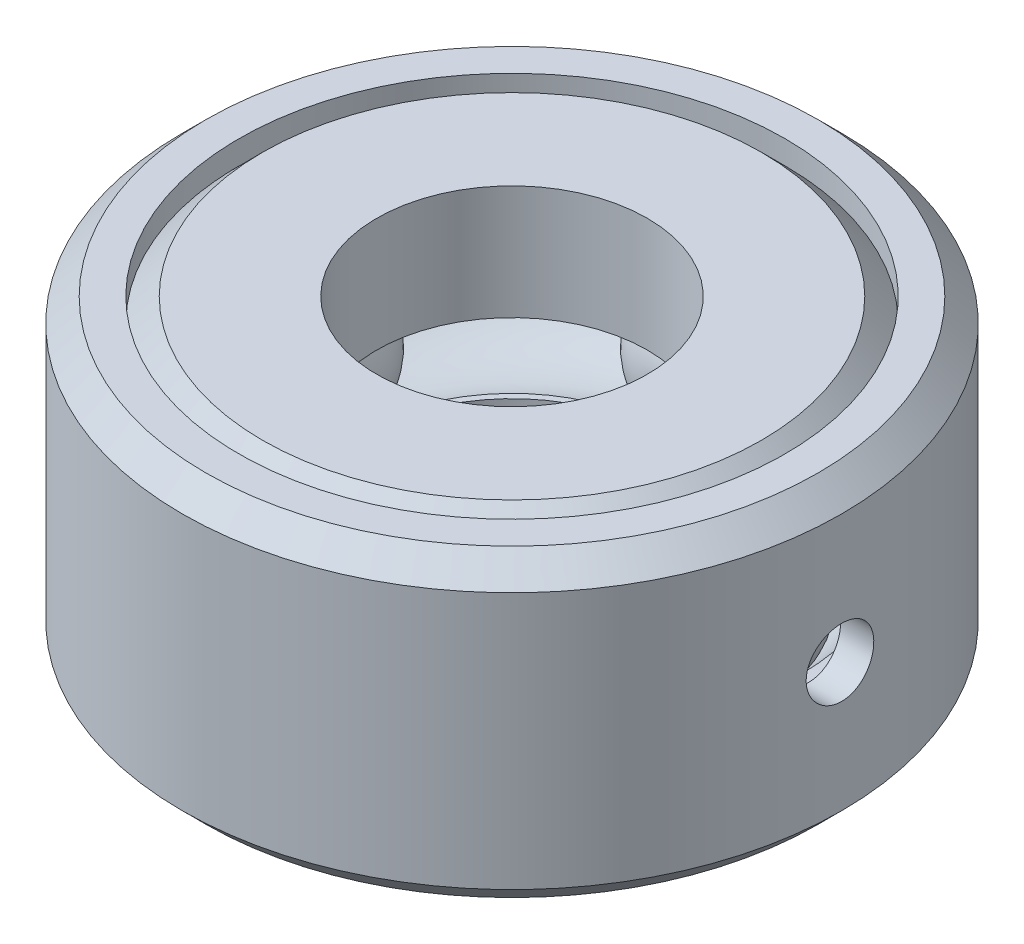
ISO-10303-21;
HEADER;
FILE_DESCRIPTION(('STEP AP214'),'2;1');
FILE_NAME('part.step','',(''),(''),'','','');
FILE_SCHEMA(('AUTOMOTIVE_DESIGN { 1 0 10303 214 1 1 1 1 }'));
ENDSEC;
DATA;
#1=APPLICATION_CONTEXT('core data for automotive mechanical design processes');
#2=APPLICATION_PROTOCOL_DEFINITION('international standard','automotive_design',2000,#1);
#3=PRODUCT_CONTEXT('',#1,'mechanical');
#4=PRODUCT('Part','Part','',(#3));
#5=PRODUCT_RELATED_PRODUCT_CATEGORY('part','',(#4));
#6=PRODUCT_DEFINITION_FORMATION('','',#4);
#7=PRODUCT_DEFINITION_CONTEXT('part definition',#1,'design');
#8=PRODUCT_DEFINITION('design','',#6,#7);
#9=PRODUCT_DEFINITION_SHAPE('','',#8);
#10=(LENGTH_UNIT() NAMED_UNIT(*) SI_UNIT(.MILLI.,.METRE.));
#11=(NAMED_UNIT(*) PLANE_ANGLE_UNIT() SI_UNIT($,.RADIAN.));
#12=(NAMED_UNIT(*) SI_UNIT($,.STERADIAN.) SOLID_ANGLE_UNIT());
#13=UNCERTAINTY_MEASURE_WITH_UNIT(LENGTH_MEASURE(1.E-05),#10,'distance_accuracy_value','');
#14=(GEOMETRIC_REPRESENTATION_CONTEXT(3) GLOBAL_UNCERTAINTY_ASSIGNED_CONTEXT((#13)) GLOBAL_UNIT_ASSIGNED_CONTEXT((#10,
#11,#12)) REPRESENTATION_CONTEXT('',''));
#15=CARTESIAN_POINT('',(0.,0.,0.));
#16=DIRECTION('',(0.,0.,1.));
#17=DIRECTION('',(1.,0.,0.));
#18=AXIS2_PLACEMENT_3D('',#15,#16,#17);
#19=CARTESIAN_POINT('',(0.,-7.14375,0.));
#20=DIRECTION('',(0.,-1.,0.));
#21=DIRECTION('',(0.,0.,-1.));
#22=AXIS2_PLACEMENT_3D('',#19,#20,#21);
#23=CYLINDRICAL_SURFACE('',#22,15.478125);
#24=CARTESIAN_POINT('',(0.,-6.03411069892396,0.));
#25=DIRECTION('',(0.,-1.,0.));
#26=DIRECTION('',(0.,0.,-1.));
#27=AXIS2_PLACEMENT_3D('',#24,#25,#26);
#28=CIRCLE('',#27,15.478125);
#29=CARTESIAN_POINT('',(0.,-6.03411069892396,-15.478125));
#30=VERTEX_POINT('',#29);
#31=EDGE_CURVE('E11',#30,#30,#28,.T.);
#32=ORIENTED_EDGE('',*,*,#31,.F.);
#33=EDGE_LOOP('',(#32));
#34=FACE_BOUND('',#33,.T.);
#35=CARTESIAN_POINT('',(0.,6.03411069892396,0.));
#36=DIRECTION('',(0.,-1.,0.));
#37=DIRECTION('',(0.,0.,-1.));
#38=AXIS2_PLACEMENT_3D('',#35,#36,#37);
#39=CIRCLE('',#38,15.478125);
#40=CARTESIAN_POINT('',(0.,6.03411069892396,-15.478125));
#41=VERTEX_POINT('',#40);
#42=EDGE_CURVE('E79',#41,#41,#39,.T.);
#43=ORIENTED_EDGE('',*,*,#42,.T.);
#44=EDGE_LOOP('',(#43));
#45=FACE_BOUND('',#44,.T.);
#46=CARTESIAN_POINT('',(15.478125,-1.5875,0.));
#47=CARTESIAN_POINT('',(15.4781239530843,-1.5874961555071,-0.0889199867715159));
#48=CARTESIAN_POINT('',(15.4773506103418,-1.58000388510939,-0.177898465576291));
#49=CARTESIAN_POINT('',(15.4743399585085,-1.55022933093622,-0.353387747904979));
#50=CARTESIAN_POINT('',(15.4721010443566,-1.52793083132391,-0.439895737274037));
#51=CARTESIAN_POINT('',(15.4664119360855,-1.46920052785929,-0.607877435908975));
#52=CARTESIAN_POINT('',(15.462962481438,-1.43277735079469,-0.689354182912763));
#53=CARTESIAN_POINT('',(15.455237810417,-1.34684856427046,-0.84502020815954));
#54=CARTESIAN_POINT('',(15.4509627561938,-1.29734552303323,-0.919210913093581));
#55=CARTESIAN_POINT('',(15.4420475774922,-1.1864617137409,-1.05849652138863));
#56=CARTESIAN_POINT('',(15.4374062752245,-1.12504161541223,-1.12356004190914));
#57=CARTESIAN_POINT('',(15.4282914204162,-0.992151140817035,-1.24247458019751));
#58=CARTESIAN_POINT('',(15.4238178757118,-0.920680295796511,-1.2963250747134));
#59=CARTESIAN_POINT('',(15.4155330561086,-0.769519935274034,-1.39139667738611));
#60=CARTESIAN_POINT('',(15.4117232839609,-0.689812405372675,-1.43258928549632));
#61=CARTESIAN_POINT('',(15.4052120633929,-0.524566090348588,-1.5009938255057));
#62=CARTESIAN_POINT('',(15.402510586252,-0.439027456400792,-1.52820611969704));
#63=CARTESIAN_POINT('',(15.3985325351609,-0.26486772713874,-1.56778429869553));
#64=CARTESIAN_POINT('',(15.3972509571595,-0.176258599272521,-1.58020233360475));
#65=CARTESIAN_POINT('',(15.3962422958536,0.00179471976225132,-1.59000071269503));
#66=CARTESIAN_POINT('',(15.3965151696989,0.0912388878441565,-1.58738147139493));
#67=CARTESIAN_POINT('',(15.3985800101881,0.268063444505963,-1.56722261574443));
#68=CARTESIAN_POINT('',(15.4003661746919,0.355450407183353,-1.54973998853043));
#69=CARTESIAN_POINT('',(15.4052472788507,0.526043310786195,-1.5004393218036));
#70=CARTESIAN_POINT('',(15.4083422370112,0.609249192575563,-1.46862107959508));
#71=CARTESIAN_POINT('',(15.4154988722847,0.769297767164598,-1.39148963649898));
#72=CARTESIAN_POINT('',(15.4195623542519,0.846128214540232,-1.34615120049619));
#73=CARTESIAN_POINT('',(15.4281966711317,0.991110969510635,-1.24328448718171));
#74=CARTESIAN_POINT('',(15.4327675216668,1.05926300974736,-1.18575583446807));
#75=CARTESIAN_POINT('',(15.4419274049905,1.18528547966697,-1.05982365549658));
#76=CARTESIAN_POINT('',(15.4465164237693,1.24310675027191,-0.991370922494405));
#77=CARTESIAN_POINT('',(15.4551755718366,1.34644516565287,-0.84570443652894));
#78=CARTESIAN_POINT('',(15.4592457004966,1.39196229552302,-0.768490672952238));
#79=CARTESIAN_POINT('',(15.4664099127705,1.46939857837733,-0.607459525806819));
#80=CARTESIAN_POINT('',(15.4695038134529,1.50131518320617,-0.523640908254246));
#81=CARTESIAN_POINT('',(15.4743651251431,1.55060811615165,-0.351795654195215));
#82=CARTESIAN_POINT('',(15.4761325778855,1.56798490174257,-0.263769150175914));
#83=CARTESIAN_POINT('',(15.4781364818146,1.5876424438966,-0.0864325302296536));
#84=CARTESIAN_POINT('',(15.4783798115395,1.58999102546963,0.00286999287364864));
#85=CARTESIAN_POINT('',(15.4773265087318,1.57970371130956,0.180597376539804));
#86=CARTESIAN_POINT('',(15.4760298981039,1.56706802871874,0.269022249568668));
#87=CARTESIAN_POINT('',(15.4720468054872,1.52722714299406,0.442288108951411));
#88=CARTESIAN_POINT('',(15.469363358584,1.50005375102779,0.527136485665286));
#89=CARTESIAN_POINT('',(15.4629075792383,1.43194152632021,0.691070678010777));
#90=CARTESIAN_POINT('',(15.459135221186,1.39100236982312,0.770156358056817));
#91=CARTESIAN_POINT('',(15.4509063099293,1.29635290304373,0.920626518399483));
#92=CARTESIAN_POINT('',(15.4464473924041,1.24259809439953,0.991982876728184));
#93=CARTESIAN_POINT('',(15.4373531377833,1.12390694912989,1.12468405006275));
#94=CARTESIAN_POINT('',(15.4327177960279,1.05897031700876,1.18602860040878));
#95=CARTESIAN_POINT('',(15.4237723800889,0.919462629348938,1.29720078644868));
#96=CARTESIAN_POINT('',(15.419463606017,0.844855972693171,1.34698386643892));
#97=CARTESIAN_POINT('',(15.4116790995339,0.688301376942994,1.43331351716352));
#98=CARTESIAN_POINT('',(15.4082033552216,0.606353542750534,1.46986027700101));
#99=CARTESIAN_POINT('',(15.4024866250567,0.437594753960745,1.52860549432891));
#100=CARTESIAN_POINT('',(15.4002433700341,0.350793062915152,1.55083033343994));
#101=CARTESIAN_POINT('',(15.3972386054293,0.17466573817968,1.5803863707159));
#102=CARTESIAN_POINT('',(15.3964770509417,0.0853401810629074,1.58771802024346));
#103=CARTESIAN_POINT('',(15.3965228904662,-0.0928563652618088,1.58727310979684));
#104=CARTESIAN_POINT('',(15.3973230161166,-0.181727539361156,1.57956654064211));
#105=CARTESIAN_POINT('',(15.4003865517389,-0.356905500105158,1.54941084003613));
#106=CARTESIAN_POINT('',(15.4026499632413,-0.443212284067464,1.52696169316475));
#107=CARTESIAN_POINT('',(15.408383002742,-0.610810185582333,1.46797764404171));
#108=CARTESIAN_POINT('',(15.411852444112,-0.692102076878648,1.43144492107069));
#109=CARTESIAN_POINT('',(15.4196069947713,-0.847411501088066,1.34533791942205));
#110=CARTESIAN_POINT('',(15.4238921008788,-0.921429062375461,1.29576369161698));
#111=CARTESIAN_POINT('',(15.4328190525166,-1.06044740123926,1.18471828622745));
#112=CARTESIAN_POINT('',(15.4374624065755,-1.12540640933313,1.12319493694925));
#113=CARTESIAN_POINT('',(15.446568922496,-1.2441087471732,0.990101758505084));
#114=CARTESIAN_POINT('',(15.451032040999,-1.29784939097626,0.918529530243505));
#115=CARTESIAN_POINT('',(15.4592875146933,-1.39270185843258,0.767162922441059));
#116=CARTESIAN_POINT('',(15.4630780730155,-1.43378006141091,0.687347392336483));
#117=CARTESIAN_POINT('',(15.469541966481,-1.5018959100463,0.521962997897064));
#118=CARTESIAN_POINT('',(15.4722165564352,-1.52894933371441,0.436400721701389));
#119=CARTESIAN_POINT('',(15.4754776245012,-1.5615266358443,0.291964794145523));
#120=CARTESIAN_POINT('',(15.4764657419542,-1.57125327644695,0.234013386463272));
#121=CARTESIAN_POINT('',(15.4777897738538,-1.58424121337437,0.117383148391143));
#122=CARTESIAN_POINT('',(15.478125691166,-1.58750253810594,0.0587043211984845));
#123=CARTESIAN_POINT('',(15.478125,-1.5875,0.));
#124=B_SPLINE_CURVE_WITH_KNOTS('',3,(#46,#47,#48,#49,#50,#51,#52,#53,#54,#55,#56,#57,#58,#59,
#60,#61,#62,#63,#64,#65,#66,#67,#68,#69,#70,#71,#72,#73,#74,#75,#76,#77,#78,#79,#80,#81,#82,#83,
#84,#85,#86,#87,#88,#89,#90,#91,#92,#93,#94,#95,#96,#97,#98,#99,#100,#101,#102,#103,#104,#105,
#106,#107,#108,#109,#110,#111,#112,#113,#114,#115,#116,#117,#118,#119,#120,#121,#122,#123),
.UNSPECIFIED.,.T.,.F.,(4,2,2,2,2,2,2,2,2,2,2,2,2,2,2,2,2,2,2,2,2,2,2,2,2,2,2,2,2,2,2,2,2,2,2,2,
2,2,4),(0.,0.266545588486843,0.533383581244815,0.800058856063831,1.06668180823524,
1.33420015120846,1.60173097503641,1.86985982115217,2.13798171850566,2.40515565682361,
2.67232223023698,2.93846906618705,3.20461966538747,3.47127017106803,3.73792888953679,
4.00582454087067,4.27372051674593,4.54166666279757,4.80960437799654,5.07633198371415,
5.34305579543503,5.60919833959687,5.87534714357915,6.14243388200146,6.40952767965692,
6.6776343298453,6.94573714952755,7.21334468932496,7.48094411871455,7.7473010580765,
8.01365827603753,8.27997429464149,8.54628927441051,8.81379428375181,9.08136326687967,
9.34963668504165,9.61760763447262,9.79357984453894,9.9695512814306),.UNSPECIFIED.);
#125=CARTESIAN_POINT('',(15.478125,-1.5875,0.));
#126=VERTEX_POINT('',#125);
#127=EDGE_CURVE('E82',#126,#126,#124,.T.);
#128=ORIENTED_EDGE('',*,*,#127,.F.);
#129=EDGE_LOOP('',(#128));
#130=FACE_BOUND('',#129,.T.);
#131=ADVANCED_FACE('F39',(#34,#45,#130),#23,.T.);
#132=CARTESIAN_POINT('',(0.,-7.14375,0.));
#133=DIRECTION('',(0.,-1.,0.));
#134=DIRECTION('',(0.,0.,-1.));
#135=AXIS2_PLACEMENT_3D('',#132,#133,#134);
#136=CYLINDRICAL_SURFACE('',#135,13.9303125);
#137=CARTESIAN_POINT('',(0.,4.92447139784791,0.));
#138=DIRECTION('',(0.,-1.,0.));
#139=DIRECTION('',(0.,0.,-1.));
#140=AXIS2_PLACEMENT_3D('',#137,#138,#139);
#141=CIRCLE('',#140,13.9303125);
#142=CARTESIAN_POINT('',(0.,4.92447139784791,-13.9303125));
#143=VERTEX_POINT('',#142);
#144=EDGE_CURVE('E67',#143,#143,#141,.T.);
#145=ORIENTED_EDGE('',*,*,#144,.F.);
#146=EDGE_LOOP('',(#145));
#147=FACE_BOUND('',#146,.T.);
#148=CARTESIAN_POINT('',(0.,-4.92447139784791,0.));
#149=DIRECTION('',(0.,-1.,0.));
#150=DIRECTION('',(0.,0.,-1.));
#151=AXIS2_PLACEMENT_3D('',#148,#149,#150);
#152=CIRCLE('',#151,13.9303125);
#153=CARTESIAN_POINT('',(0.,-4.92447139784791,-13.9303125));
#154=VERTEX_POINT('',#153);
#155=EDGE_CURVE('E64',#154,#154,#152,.T.);
#156=ORIENTED_EDGE('',*,*,#155,.T.);
#157=EDGE_LOOP('',(#156));
#158=FACE_BOUND('',#157,.T.);
#159=CARTESIAN_POINT('',(13.8395610514805,0.,1.5875));
#160=CARTESIAN_POINT('',(13.8395622268779,0.0888593892608518,1.58749618686039));
#161=CARTESIAN_POINT('',(13.8404260906163,0.177775826264972,1.58001406805566));
#162=CARTESIAN_POINT('',(13.8437872892556,0.353138516025982,1.55028224181444));
#163=CARTESIAN_POINT('',(13.8462863747378,0.439582017760158,1.52801670766478));
#164=CARTESIAN_POINT('',(13.8526313550373,0.607434224038868,1.46937916148668));
#165=CARTESIAN_POINT('',(13.8564763813982,0.688846135413641,1.43301624404547));
#166=CARTESIAN_POINT('',(13.8650789500554,0.84439539793967,1.34723471586057));
#167=CARTESIAN_POINT('',(13.8698363245155,0.91853408329253,1.29781850577921));
#168=CARTESIAN_POINT('',(13.8797524740017,1.05779540609215,1.18708529161634));
#169=CARTESIAN_POINT('',(13.8849128401947,1.12287915604463,1.12571951886663));
#170=CARTESIAN_POINT('',(13.8950391644464,1.24184767471582,0.992933830768743));
#171=CARTESIAN_POINT('',(13.9000051131945,1.29573190762141,0.921513434656114));
#172=CARTESIAN_POINT('',(13.90919913437,1.39090922105532,0.770403969485906));
#173=CARTESIAN_POINT('',(13.9134251495219,1.43216742739877,0.690692798868989));
#174=CARTESIAN_POINT('',(13.9206457288841,1.50069828235261,0.525417281922924));
#175=CARTESIAN_POINT('',(13.9236403314239,1.52797136627637,0.439853117873241));
#176=CARTESIAN_POINT('',(13.9280494831672,1.56764248433091,0.265696342084031));
#177=CARTESIAN_POINT('',(13.9294708660438,1.5801048699854,0.177118564722521));
#178=CARTESIAN_POINT('',(13.9305967220498,1.59000011603427,-0.000881855590568196));
#179=CARTESIAN_POINT('',(13.9303012519454,1.58743347334874,-0.0903044705108183));
#180=CARTESIAN_POINT('',(13.9280322516452,1.56739540203593,-0.267018819162722));
#181=CARTESIAN_POINT('',(13.9260665127516,1.54999317570139,-0.35431851397619));
#182=CARTESIAN_POINT('',(13.9206866856252,1.50088592704909,-0.524750141143267));
#183=CARTESIAN_POINT('',(13.9172725738617,1.46918067235978,-0.607882005760596));
#184=CARTESIAN_POINT('',(13.9093662869913,1.39229270291149,-0.767834230875383));
#185=CARTESIAN_POINT('',(13.9048716955688,1.34707972453035,-0.844639919569219));
#186=CARTESIAN_POINT('',(13.8953080012828,1.24448173196703,-0.989599491534462));
#187=CARTESIAN_POINT('',(13.8902388765176,1.18709625368426,-1.05775304476769));
#188=CARTESIAN_POINT('',(13.8800601536455,1.0613938737598,-1.18387970774223));
#189=CARTESIAN_POINT('',(13.874950489227,0.993016712047259,-1.24179277140944));
#190=CARTESIAN_POINT('',(13.8652951472049,0.847479843761716,-1.34532868458285));
#191=CARTESIAN_POINT('',(13.8607494708746,0.770320117358782,-1.39095150633844));
#192=CARTESIAN_POINT('',(13.8527366518241,0.609358351650445,-1.46861355196661));
#193=CARTESIAN_POINT('',(13.8492698500637,0.525554222973512,-1.50064848277772));
#194=CARTESIAN_POINT('',(13.8438141683692,0.353707995131995,-1.55017484083026));
#195=CARTESIAN_POINT('',(13.8418252295802,0.265666064883854,-1.56766684723767));
#196=CARTESIAN_POINT('',(13.8395609938691,0.0883722492987613,-1.58753237334695));
#197=CARTESIAN_POINT('',(13.8392761454651,-0.000870076614533223,-1.58999016207764));
#198=CARTESIAN_POINT('',(13.8404271102251,-0.178495239834938,-1.57993934553969));
#199=CARTESIAN_POINT('',(13.8418628930382,-0.266878092274927,-1.56743100426468));
#200=CARTESIAN_POINT('',(13.8462846429256,-0.440026152264252,-1.52787373789018));
#201=CARTESIAN_POINT('',(13.8492663069672,-0.524800698533142,-1.50086516748244));
#202=CARTESIAN_POINT('',(13.8564403772041,-0.688616982680918,-1.43311549553363));
#203=CARTESIAN_POINT('',(13.8606328190721,-0.767658551565339,-1.39237398937821));
#204=CARTESIAN_POINT('',(13.8697790635717,-0.918147775991338,-1.29810592664415));
#205=CARTESIAN_POINT('',(13.8747361390073,-0.989560442500136,-1.24452383629236));
#206=CARTESIAN_POINT('',(13.884842644483,-1.12240874324144,-1.12617461743575));
#207=CARTESIAN_POINT('',(13.8899920807187,-1.18384405578094,-1.06140712842665));
#208=CARTESIAN_POINT('',(13.8999322097151,-1.29528720923773,-0.92215868641165));
#209=CARTESIAN_POINT('',(13.904721098536,-1.34523986322066,-0.847633419301476));
#210=CARTESIAN_POINT('',(13.9133739289703,-1.43191885853933,-0.691201995603963));
#211=CARTESIAN_POINT('',(13.9172378864838,-1.46864542724483,-0.609295965929653));
#212=CARTESIAN_POINT('',(13.9235974255924,-1.52773746916376,-0.440615735535861));
#213=CARTESIAN_POINT('',(13.9260961082448,-1.55013550785467,-0.353853064864225));
#214=CARTESIAN_POINT('',(13.9294563743146,-1.58004079985156,-0.177768306718376));
#215=CARTESIAN_POINT('',(13.9303180184842,-1.58754860575063,-0.0884463143482384));
#216=CARTESIAN_POINT('',(13.9303069585414,-1.58745119367456,0.0896812305051286));
#217=CARTESIAN_POINT('',(13.9294440504273,-1.57993133755413,0.178486842490444));
#218=CARTESIAN_POINT('',(13.9261002341824,-1.55017201551395,0.353563906135039));
#219=CARTESIAN_POINT('',(13.9236193259457,-1.52793254863047,0.439835357628403));
#220=CARTESIAN_POINT('',(13.9173172039266,-1.46939066926815,0.607388843620715));
#221=CARTESIAN_POINT('',(13.9134963102309,-1.43309161503373,0.688672064231455));
#222=CARTESIAN_POINT('',(13.9049386279004,-1.34746984137599,0.844006306181949));
#223=CARTESIAN_POINT('',(13.9002018359067,-1.29814707419097,0.918057300997692));
#224=CARTESIAN_POINT('',(13.8903098421313,-1.18755985438036,1.0572619898554));
#225=CARTESIAN_POINT('',(13.8851525012924,-1.12623180266259,1.12236500949701));
#226=CARTESIAN_POINT('',(13.8750183152747,-0.993504824591994,1.24139082202088));
#227=CARTESIAN_POINT('',(13.8700415133789,-0.922103503031296,1.29531094829667));
#228=CARTESIAN_POINT('',(13.8608147520585,-0.770996863921944,1.39058485171154));
#229=CARTESIAN_POINT('',(13.8565671920285,-0.691265471754633,1.43189748089494));
#230=CARTESIAN_POINT('',(13.8493081085589,-0.525996114271928,1.50049049818658));
#231=CARTESIAN_POINT('',(13.8462952181066,-0.440464693687051,1.52778641397053));
#232=CARTESIAN_POINT('',(13.8425914832913,-0.295392044212082,1.56090814094677));
#233=CARTESIAN_POINT('',(13.841460595838,-0.236772032538757,1.57086608555125));
#234=CARTESIAN_POINT('',(13.8399449892649,-0.11877650857569,1.58416327008271));
#235=CARTESIAN_POINT('',(13.8395602657472,-0.0594010007408405,1.58750254901942));
#236=CARTESIAN_POINT('',(13.8395610514805,0.,1.5875));
#237=B_SPLINE_CURVE_WITH_KNOTS('',3,(#159,#160,#161,#162,#163,#164,#165,#166,#167,#168,#169,
#170,#171,#172,#173,#174,#175,#176,#177,#178,#179,#180,#181,#182,#183,#184,#185,#186,#187,#188,
#189,#190,#191,#192,#193,#194,#195,#196,#197,#198,#199,#200,#201,#202,#203,#204,#205,#206,#207,
#208,#209,#210,#211,#212,#213,#214,#215,#216,#217,#218,#219,#220,#221,#222,#223,#224,#225,#226,
#227,#228,#229,#230,#231,#232,#233,#234,#235,#236),.UNSPECIFIED.,.T.,.F.,(4,2,2,2,2,2,2,2,2,2,2,
2,2,2,2,2,2,2,2,2,2,2,2,2,2,2,2,2,2,2,2,2,2,2,2,2,2,2,4),(0.,0.266361204744225,
0.533008029168913,0.799483118303192,1.06590923344574,1.33344638377016,1.60099633080124,
1.86927873945182,2.13755279679806,2.40465690878378,2.67175218928356,2.93760834758058,
3.20346882521712,3.46992947960698,3.73640029516238,4.00438520879524,4.2723707275165,
4.54044085266319,4.80850030151589,5.07505585012082,5.34160669691359,5.60741953904702,
5.87324021352567,6.14023196017685,6.40723231355206,6.67549025317784,6.94374358095857,
7.21138504358317,7.4790165735498,7.74513219321393,8.01124783030121,8.27729994270854,
8.54335303081885,8.81085568636922,9.07842205586397,9.3468525840287,9.61498510059609,
9.79304411615695,9.97110208225321),.UNSPECIFIED.);
#238=CARTESIAN_POINT('',(13.8395610514805,0.,1.5875));
#239=VERTEX_POINT('',#238);
#240=EDGE_CURVE('E43',#239,#239,#237,.T.);
#241=ORIENTED_EDGE('',*,*,#240,.F.);
#242=EDGE_LOOP('',(#241));
#243=FACE_BOUND('',#242,.T.);
#244=ADVANCED_FACE('F109',(#147,#158,#243),#136,.F.);
#245=CARTESIAN_POINT('',(0.,-6.03411069892396,0.));
#246=DIRECTION('',(0.,1.,0.));
#247=DIRECTION('',(0.,0.,1.));
#248=AXIS2_PLACEMENT_3D('',#245,#246,#247);
#249=CONICAL_SURFACE('',#248,15.478125,0.785398163397455);
#250=CARTESIAN_POINT('',(0.,-7.14375,0.));
#251=DIRECTION('',(0.,-1.,0.));
#252=DIRECTION('',(0.,0.,-1.));
#253=AXIS2_PLACEMENT_3D('',#250,#251,#252);
#254=CIRCLE('',#253,14.3684856989239);
#255=CARTESIAN_POINT('',(0.,-7.14375,-14.3684856989239));
#256=VERTEX_POINT('',#255);
#257=EDGE_CURVE('E52',#256,#256,#254,.T.);
#258=ORIENTED_EDGE('',*,*,#257,.F.);
#259=EDGE_LOOP('',(#258));
#260=FACE_BOUND('',#259,.T.);
#261=ORIENTED_EDGE('',*,*,#31,.T.);
#262=EDGE_LOOP('',(#261));
#263=FACE_BOUND('',#262,.T.);
#264=ADVANCED_FACE('F113',(#260,#263),#249,.T.);
#265=CARTESIAN_POINT('',(0.,-7.14375,14.3684856989239));
#266=DIRECTION('',(0.,1.,0.));
#267=DIRECTION('',(0.,0.,1.));
#268=AXIS2_PLACEMENT_3D('',#265,#266,#267);
#269=PLANE('',#268);
#270=CARTESIAN_POINT('',(0.,-7.14375,0.));
#271=DIRECTION('',(0.,-1.,0.));
#272=DIRECTION('',(0.,0.,-1.));
#273=AXIS2_PLACEMENT_3D('',#270,#271,#272);
#274=CIRCLE('',#273,12.820673198924);
#275=CARTESIAN_POINT('',(0.,-7.14375,-12.820673198924));
#276=VERTEX_POINT('',#275);
#277=EDGE_CURVE('E56',#276,#276,#274,.T.);
#278=ORIENTED_EDGE('',*,*,#277,.F.);
#279=EDGE_LOOP('',(#278));
#280=FACE_BOUND('',#279,.T.);
#281=ORIENTED_EDGE('',*,*,#257,.T.);
#282=EDGE_LOOP('',(#281));
#283=FACE_BOUND('',#282,.T.);
#284=ADVANCED_FACE('F121',(#280,#283),#269,.F.);
#285=CARTESIAN_POINT('',(0.,-7.14375,0.));
#286=DIRECTION('',(0.,-1.,0.));
#287=DIRECTION('',(0.,0.,-1.));
#288=AXIS2_PLACEMENT_3D('',#285,#286,#287);
#289=CYLINDRICAL_SURFACE('',#288,12.820673198924);
#290=CARTESIAN_POINT('',(0.,-6.03411069892395,0.));
#291=DIRECTION('',(0.,-1.,0.));
#292=DIRECTION('',(0.,0.,-1.));
#293=AXIS2_PLACEMENT_3D('',#290,#291,#292);
#294=CIRCLE('',#293,12.820673198924);
#295=CARTESIAN_POINT('',(0.,-6.03411069892395,-12.820673198924));
#296=VERTEX_POINT('',#295);
#297=EDGE_CURVE('E61',#296,#296,#294,.T.);
#298=ORIENTED_EDGE('',*,*,#297,.F.);
#299=EDGE_LOOP('',(#298));
#300=FACE_BOUND('',#299,.T.);
#301=ORIENTED_EDGE('',*,*,#277,.T.);
#302=EDGE_LOOP('',(#301));
#303=FACE_BOUND('',#302,.T.);
#304=ADVANCED_FACE('F117',(#300,#303),#289,.F.);
#305=CARTESIAN_POINT('',(0.,-6.03411069892395,0.));
#306=DIRECTION('',(0.,1.,0.));
#307=DIRECTION('',(0.,0.,1.));
#308=AXIS2_PLACEMENT_3D('',#305,#306,#307);
#309=CONICAL_SURFACE('',#308,12.820673198924,0.785398163397453);
#310=ORIENTED_EDGE('',*,*,#155,.F.);
#311=EDGE_LOOP('',(#310));
#312=FACE_BOUND('',#311,.T.);
#313=ORIENTED_EDGE('',*,*,#297,.T.);
#314=EDGE_LOOP('',(#313));
#315=FACE_BOUND('',#314,.T.);
#316=ADVANCED_FACE('F107',(#312,#315),#309,.F.);
#317=CARTESIAN_POINT('',(0.,4.92447139784791,0.));
#318=DIRECTION('',(0.,-1.,0.));
#319=DIRECTION('',(0.,0.,-1.));
#320=AXIS2_PLACEMENT_3D('',#317,#318,#319);
#321=CONICAL_SURFACE('',#320,13.9303125,0.785398163397444);
#322=CARTESIAN_POINT('',(0.,6.03411069892396,0.));
#323=DIRECTION('',(0.,-1.,0.));
#324=DIRECTION('',(0.,0.,-1.));
#325=AXIS2_PLACEMENT_3D('',#322,#323,#324);
#326=CIRCLE('',#325,12.820673198924);
#327=CARTESIAN_POINT('',(0.,6.03411069892396,-12.820673198924));
#328=VERTEX_POINT('',#327);
#329=EDGE_CURVE('E70',#328,#328,#326,.T.);
#330=ORIENTED_EDGE('',*,*,#329,.F.);
#331=EDGE_LOOP('',(#330));
#332=FACE_BOUND('',#331,.T.);
#333=ORIENTED_EDGE('',*,*,#144,.T.);
#334=EDGE_LOOP('',(#333));
#335=FACE_BOUND('',#334,.T.);
#336=ADVANCED_FACE('F104',(#332,#335),#321,.F.);
#337=CARTESIAN_POINT('',(0.,-7.14375,0.));
#338=DIRECTION('',(0.,-1.,0.));
#339=DIRECTION('',(0.,0.,-1.));
#340=AXIS2_PLACEMENT_3D('',#337,#338,#339);
#341=CYLINDRICAL_SURFACE('',#340,12.820673198924);
#342=CARTESIAN_POINT('',(0.,7.14375,0.));
#343=DIRECTION('',(0.,-1.,0.));
#344=DIRECTION('',(0.,0.,-1.));
#345=AXIS2_PLACEMENT_3D('',#342,#343,#344);
#346=CIRCLE('',#345,12.820673198924);
#347=CARTESIAN_POINT('',(0.,7.14375,-12.820673198924));
#348=VERTEX_POINT('',#347);
#349=EDGE_CURVE('E73',#348,#348,#346,.T.);
#350=ORIENTED_EDGE('',*,*,#349,.F.);
#351=EDGE_LOOP('',(#350));
#352=FACE_BOUND('',#351,.T.);
#353=ORIENTED_EDGE('',*,*,#329,.T.);
#354=EDGE_LOOP('',(#353));
#355=FACE_BOUND('',#354,.T.);
#356=ADVANCED_FACE('F100',(#352,#355),#341,.F.);
#357=CARTESIAN_POINT('',(0.,7.14375,12.820673198924));
#358=DIRECTION('',(0.,-1.,0.));
#359=DIRECTION('',(0.,0.,-1.));
#360=AXIS2_PLACEMENT_3D('',#357,#358,#359);
#361=PLANE('',#360);
#362=CARTESIAN_POINT('',(0.,7.14375,0.));
#363=DIRECTION('',(0.,-1.,0.));
#364=DIRECTION('',(0.,0.,-1.));
#365=AXIS2_PLACEMENT_3D('',#362,#363,#364);
#366=CIRCLE('',#365,14.368485698924);
#367=CARTESIAN_POINT('',(0.,7.14375,-14.368485698924));
#368=VERTEX_POINT('',#367);
#369=EDGE_CURVE('E76',#368,#368,#366,.T.);
#370=ORIENTED_EDGE('',*,*,#369,.F.);
#371=EDGE_LOOP('',(#370));
#372=FACE_BOUND('',#371,.T.);
#373=ORIENTED_EDGE('',*,*,#349,.T.);
#374=EDGE_LOOP('',(#373));
#375=FACE_BOUND('',#374,.T.);
#376=ADVANCED_FACE('F96',(#372,#375),#361,.F.);
#377=CARTESIAN_POINT('',(0.,7.14375,0.));
#378=DIRECTION('',(0.,-1.,0.));
#379=DIRECTION('',(0.,0.,-1.));
#380=AXIS2_PLACEMENT_3D('',#377,#378,#379);
#381=CONICAL_SURFACE('',#380,14.368485698924,0.785398163397445);
#382=ORIENTED_EDGE('',*,*,#42,.F.);
#383=EDGE_LOOP('',(#382));
#384=FACE_BOUND('',#383,.T.);
#385=ORIENTED_EDGE('',*,*,#369,.T.);
#386=EDGE_LOOP('',(#385));
#387=FACE_BOUND('',#386,.T.);
#388=ADVANCED_FACE('F91',(#384,#387),#381,.T.);
#389=CARTESIAN_POINT('',(15.478125,0.,0.));
#390=DIRECTION('',(-1.,0.,0.));
#391=DIRECTION('',(0.,0.,1.));
#392=AXIS2_PLACEMENT_3D('',#389,#390,#391);
#393=CYLINDRICAL_SURFACE('',#392,1.5875);
#394=ORIENTED_EDGE('',*,*,#240,.T.);
#395=EDGE_LOOP('',(#394));
#396=FACE_BOUND('',#395,.T.);
#397=ORIENTED_EDGE('',*,*,#127,.T.);
#398=EDGE_LOOP('',(#397));
#399=FACE_BOUND('',#398,.T.);
#400=ADVANCED_FACE('F87',(#396,#399),#393,.F.);
#401=CLOSED_SHELL('',(#131,#244,#264,#284,#304,#316,#336,#356,#376,#388,#400));
#402=MANIFOLD_SOLID_BREP('B2',#401);
#403=CARTESIAN_POINT('',(-10.14015625,0.,1.06212498959486E-13));
#404=DIRECTION('',(0.,1.,0.));
#405=DIRECTION('',(1.,0.,0.));
#406=AXIS2_PLACEMENT_3D('',#403,#404,#405);
#407=SPHERICAL_SURFACE('',#406,3.571875);
#408=CARTESIAN_POINT('',(-10.14015625,3.571875,1.06212498959486E-13));
#409=VERTEX_POINT('',#408);
#410=VERTEX_LOOP('',#409);
#411=FACE_BOUND('',#410,.T.);
#412=ADVANCED_FACE('F227',(#411),#407,.T.);
#413=CLOSED_SHELL('',(#412));
#414=MANIFOLD_SOLID_BREP('B6',#413);
#415=CARTESIAN_POINT('',(0.,0.,-10.14015625));
#416=DIRECTION('',(0.,1.,0.));
#417=DIRECTION('',(0.,0.,1.));
#418=AXIS2_PLACEMENT_3D('',#415,#416,#417);
#419=SPHERICAL_SURFACE('',#418,3.571875);
#420=CARTESIAN_POINT('',(0.,3.571875,-10.14015625));
#421=VERTEX_POINT('',#420);
#422=VERTEX_LOOP('',#421);
#423=FACE_BOUND('',#422,.T.);
#424=ADVANCED_FACE('F258',(#423),#419,.T.);
#425=CLOSED_SHELL('',(#424));
#426=MANIFOLD_SOLID_BREP('B35',#425);
#427=CARTESIAN_POINT('',(10.14015625,0.,0.));
#428=DIRECTION('',(0.,1.,0.));
#429=DIRECTION('',(-1.,0.,0.));
#430=AXIS2_PLACEMENT_3D('',#427,#428,#429);
#431=SPHERICAL_SURFACE('',#430,3.571875);
#432=CARTESIAN_POINT('',(10.14015625,3.571875,0.));
#433=VERTEX_POINT('',#432);
#434=VERTEX_LOOP('',#433);
#435=FACE_BOUND('',#434,.T.);
#436=ADVANCED_FACE('F289',(#435),#431,.T.);
#437=CLOSED_SHELL('',(#436));
#438=MANIFOLD_SOLID_BREP('B223',#437);
#439=CARTESIAN_POINT('',(0.,0.,10.14015625));
#440=DIRECTION('',(0.,1.,0.));
#441=DIRECTION('',(0.,0.,-1.));
#442=AXIS2_PLACEMENT_3D('',#439,#440,#441);
#443=SPHERICAL_SURFACE('',#442,3.571875);
#444=CARTESIAN_POINT('',(0.,3.571875,10.14015625));
#445=VERTEX_POINT('',#444);
#446=VERTEX_LOOP('',#445);
#447=FACE_BOUND('',#446,.T.);
#448=ADVANCED_FACE('F322',(#447),#443,.T.);
#449=CLOSED_SHELL('',(#448));
#450=MANIFOLD_SOLID_BREP('B254',#449);
#451=CARTESIAN_POINT('',(0.,-7.14375,11.7110338978479));
#452=DIRECTION('',(0.,1.,0.));
#453=DIRECTION('',(0.,0.,1.));
#454=AXIS2_PLACEMENT_3D('',#451,#452,#453);
#455=PLANE('',#454);
#456=CARTESIAN_POINT('',(0.,-7.14375,0.));
#457=DIRECTION('',(0.,-1.,0.));
#458=DIRECTION('',(0.,0.,-1.));
#459=AXIS2_PLACEMENT_3D('',#456,#457,#458);
#460=CIRCLE('',#459,6.7437);
#461=CARTESIAN_POINT('',(0.,-7.14375,-6.7437));
#462=VERTEX_POINT('',#461);
#463=EDGE_CURVE('E366',#462,#462,#460,.T.);
#464=ORIENTED_EDGE('',*,*,#463,.F.);
#465=EDGE_LOOP('',(#464));
#466=FACE_BOUND('',#465,.T.);
#467=CARTESIAN_POINT('',(0.,-7.14375,0.));
#468=DIRECTION('',(0.,-1.,0.));
#469=DIRECTION('',(0.,0.,-1.));
#470=AXIS2_PLACEMENT_3D('',#467,#468,#469);
#471=CIRCLE('',#470,11.7110338978479);
#472=CARTESIAN_POINT('',(0.,-7.14375,-11.7110338978479));
#473=VERTEX_POINT('',#472);
#474=EDGE_CURVE('E321',#473,#473,#471,.T.);
#475=ORIENTED_EDGE('',*,*,#474,.T.);
#476=EDGE_LOOP('',(#475));
#477=FACE_BOUND('',#476,.T.);
#478=ADVANCED_FACE('F341',(#466,#477),#455,.F.);
#479=CARTESIAN_POINT('',(0.,-4.92447139784791,0.));
#480=DIRECTION('',(0.,1.,0.));
#481=DIRECTION('',(0.,0.,1.));
#482=AXIS2_PLACEMENT_3D('',#479,#480,#481);
#483=CONICAL_SURFACE('',#482,13.9303125,0.785398163397452);
#484=ORIENTED_EDGE('',*,*,#474,.F.);
#485=EDGE_LOOP('',(#484));
#486=FACE_BOUND('',#485,.T.);
#487=CARTESIAN_POINT('',(0.,-4.92447139784791,0.));
#488=DIRECTION('',(0.,-1.,0.));
#489=DIRECTION('',(0.,0.,-1.));
#490=AXIS2_PLACEMENT_3D('',#487,#488,#489);
#491=CIRCLE('',#490,13.9303125);
#492=CARTESIAN_POINT('',(0.,-4.92447139784791,-13.9303125));
#493=VERTEX_POINT('',#492);
#494=EDGE_CURVE('E347',#493,#493,#491,.T.);
#495=ORIENTED_EDGE('',*,*,#494,.T.);
#496=EDGE_LOOP('',(#495));
#497=FACE_BOUND('',#496,.T.);
#498=ADVANCED_FACE('F373',(#486,#497),#483,.T.);
#499=CARTESIAN_POINT('',(0.,-7.14375,0.));
#500=DIRECTION('',(0.,-1.,0.));
#501=DIRECTION('',(0.,0.,-1.));
#502=AXIS2_PLACEMENT_3D('',#499,#500,#501);
#503=CYLINDRICAL_SURFACE('',#502,13.9303125);
#504=ORIENTED_EDGE('',*,*,#494,.F.);
#505=EDGE_LOOP('',(#504));
#506=FACE_BOUND('',#505,.T.);
#507=CARTESIAN_POINT('',(0.,-1.7859375,0.));
#508=DIRECTION('',(0.,-1.,0.));
#509=DIRECTION('',(0.,0.,-1.));
#510=AXIS2_PLACEMENT_3D('',#507,#508,#509);
#511=CIRCLE('',#510,13.9303125);
#512=CARTESIAN_POINT('',(0.,-1.7859375,-13.9303125));
#513=VERTEX_POINT('',#512);
#514=EDGE_CURVE('E351',#513,#513,#511,.T.);
#515=ORIENTED_EDGE('',*,*,#514,.T.);
#516=EDGE_LOOP('',(#515));
#517=FACE_BOUND('',#516,.T.);
#518=ADVANCED_FACE('F377',(#506,#517),#503,.T.);
#519=CARTESIAN_POINT('',(0.,-1.7859375,13.2334907391425));
#520=DIRECTION('',(0.,-1.,0.));
#521=DIRECTION('',(0.,0.,-1.));
#522=AXIS2_PLACEMENT_3D('',#519,#520,#521);
#523=PLANE('',#522);
#524=ORIENTED_EDGE('',*,*,#514,.F.);
#525=EDGE_LOOP('',(#524));
#526=FACE_BOUND('',#525,.T.);
#527=CARTESIAN_POINT('',(0.,-1.7859375,0.));
#528=DIRECTION('',(0.,-1.,0.));
#529=DIRECTION('',(0.,0.,-1.));
#530=AXIS2_PLACEMENT_3D('',#527,#528,#529);
#531=CIRCLE('',#530,13.2334907391425);
#532=CARTESIAN_POINT('',(0.,-1.7859375,-13.2334907391425));
#533=VERTEX_POINT('',#532);
#534=EDGE_CURVE('E355',#533,#533,#531,.T.);
#535=ORIENTED_EDGE('',*,*,#534,.T.);
#536=EDGE_LOOP('',(#535));
#537=FACE_BOUND('',#536,.T.);
#538=ADVANCED_FACE('F382',(#526,#537),#523,.F.);
#539=CARTESIAN_POINT('',(0.,0.,0.));
#540=DIRECTION('',(0.,-1.,0.));
#541=DIRECTION('',(0.,0.,-1.));
#542=AXIS2_PLACEMENT_3D('',#539,#540,#541);
#543=TOROIDAL_SURFACE('',#542,10.14015625,3.571875);
#544=ORIENTED_EDGE('',*,*,#534,.F.);
#545=EDGE_LOOP('',(#544));
#546=FACE_BOUND('',#545,.T.);
#547=CARTESIAN_POINT('',(0.,-1.7859375,0.));
#548=DIRECTION('',(0.,-1.,0.));
#549=DIRECTION('',(0.,0.,-1.));
#550=AXIS2_PLACEMENT_3D('',#547,#548,#549);
#551=CIRCLE('',#550,7.04682176085746);
#552=CARTESIAN_POINT('',(0.,-1.7859375,-7.04682176085746));
#553=VERTEX_POINT('',#552);
#554=EDGE_CURVE('E360',#553,#553,#551,.T.);
#555=ORIENTED_EDGE('',*,*,#554,.T.);
#556=EDGE_LOOP('',(#555));
#557=FACE_BOUND('',#556,.T.);
#558=ADVANCED_FACE('F388',(#546,#557),#543,.F.);
#559=CARTESIAN_POINT('',(0.,-1.7859375,6.7437));
#560=DIRECTION('',(0.,-1.,0.));
#561=DIRECTION('',(0.,0.,-1.));
#562=AXIS2_PLACEMENT_3D('',#559,#560,#561);
#563=PLANE('',#562);
#564=ORIENTED_EDGE('',*,*,#554,.F.);
#565=EDGE_LOOP('',(#564));
#566=FACE_BOUND('',#565,.T.);
#567=CARTESIAN_POINT('',(0.,-1.7859375,0.));
#568=DIRECTION('',(0.,-1.,0.));
#569=DIRECTION('',(0.,0.,-1.));
#570=AXIS2_PLACEMENT_3D('',#567,#568,#569);
#571=CIRCLE('',#570,6.7437);
#572=CARTESIAN_POINT('',(0.,-1.7859375,-6.7437));
#573=VERTEX_POINT('',#572);
#574=EDGE_CURVE('E363',#573,#573,#571,.T.);
#575=ORIENTED_EDGE('',*,*,#574,.T.);
#576=EDGE_LOOP('',(#575));
#577=FACE_BOUND('',#576,.T.);
#578=ADVANCED_FACE('F392',(#566,#577),#563,.F.);
#579=CARTESIAN_POINT('',(0.,-7.14375,0.));
#580=DIRECTION('',(0.,-1.,0.));
#581=DIRECTION('',(0.,0.,-1.));
#582=AXIS2_PLACEMENT_3D('',#579,#580,#581);
#583=CYLINDRICAL_SURFACE('',#582,6.7437);
#584=ORIENTED_EDGE('',*,*,#574,.F.);
#585=EDGE_LOOP('',(#584));
#586=FACE_BOUND('',#585,.T.);
#587=ORIENTED_EDGE('',*,*,#463,.T.);
#588=EDGE_LOOP('',(#587));
#589=FACE_BOUND('',#588,.T.);
#590=ADVANCED_FACE('F370',(#586,#589),#583,.F.);
#591=CLOSED_SHELL('',(#478,#498,#518,#538,#558,#578,#590));
#592=MANIFOLD_SOLID_BREP('B285',#591);
#593=CARTESIAN_POINT('',(0.,0.,0.));
#594=DIRECTION('',(0.,-1.,0.));
#595=DIRECTION('',(0.,0.,-1.));
#596=AXIS2_PLACEMENT_3D('',#593,#594,#595);
#597=TOROIDAL_SURFACE('',#596,10.14015625,3.571875);
#598=CARTESIAN_POINT('',(0.,1.7859375,0.));
#599=DIRECTION('',(0.,-1.,0.));
#600=DIRECTION('',(0.,0.,-1.));
#601=AXIS2_PLACEMENT_3D('',#598,#599,#600);
#602=CIRCLE('',#601,7.04682176085746);
#603=CARTESIAN_POINT('',(0.,1.7859375,-7.04682176085746));
#604=VERTEX_POINT('',#603);
#605=EDGE_CURVE('E340',#604,#604,#602,.T.);
#606=ORIENTED_EDGE('',*,*,#605,.F.);
#607=EDGE_LOOP('',(#606));
#608=FACE_BOUND('',#607,.T.);
#609=CARTESIAN_POINT('',(0.,1.7859375,0.));
#610=DIRECTION('',(0.,-1.,0.));
#611=DIRECTION('',(0.,0.,-1.));
#612=AXIS2_PLACEMENT_3D('',#609,#610,#611);
#613=CIRCLE('',#612,13.2334907391425);
#614=CARTESIAN_POINT('',(0.,1.7859375,-13.2334907391425));
#615=VERTEX_POINT('',#614);
#616=EDGE_CURVE('E472',#615,#615,#613,.T.);
#617=ORIENTED_EDGE('',*,*,#616,.T.);
#618=EDGE_LOOP('',(#617));
#619=FACE_BOUND('',#618,.T.);
#620=ADVANCED_FACE('F447',(#608,#619),#597,.F.);
#621=CARTESIAN_POINT('',(0.,1.7859375,6.35));
#622=DIRECTION('',(0.,1.,0.));
#623=DIRECTION('',(0.,0.,1.));
#624=AXIS2_PLACEMENT_3D('',#621,#622,#623);
#625=PLANE('',#624);
#626=CARTESIAN_POINT('',(0.,1.7859375,0.));
#627=DIRECTION('',(0.,-1.,0.));
#628=DIRECTION('',(0.,0.,-1.));
#629=AXIS2_PLACEMENT_3D('',#626,#627,#628);
#630=CIRCLE('',#629,6.35);
#631=CARTESIAN_POINT('',(0.,1.7859375,-6.35));
#632=VERTEX_POINT('',#631);
#633=EDGE_CURVE('E453',#632,#632,#630,.T.);
#634=ORIENTED_EDGE('',*,*,#633,.F.);
#635=EDGE_LOOP('',(#634));
#636=FACE_BOUND('',#635,.T.);
#637=ORIENTED_EDGE('',*,*,#605,.T.);
#638=EDGE_LOOP('',(#637));
#639=FACE_BOUND('',#638,.T.);
#640=ADVANCED_FACE('F503',(#636,#639),#625,.F.);
#641=CARTESIAN_POINT('',(0.,-7.14375,0.));
#642=DIRECTION('',(0.,-1.,0.));
#643=DIRECTION('',(0.,0.,-1.));
#644=AXIS2_PLACEMENT_3D('',#641,#642,#643);
#645=CYLINDRICAL_SURFACE('',#644,6.35);
#646=CARTESIAN_POINT('',(0.,7.14375,0.));
#647=DIRECTION('',(0.,-1.,0.));
#648=DIRECTION('',(0.,0.,-1.));
#649=AXIS2_PLACEMENT_3D('',#646,#647,#648);
#650=CIRCLE('',#649,6.35);
#651=CARTESIAN_POINT('',(0.,7.14375,-6.35));
#652=VERTEX_POINT('',#651);
#653=EDGE_CURVE('E457',#652,#652,#650,.T.);
#654=ORIENTED_EDGE('',*,*,#653,.F.);
#655=EDGE_LOOP('',(#654));
#656=FACE_BOUND('',#655,.T.);
#657=ORIENTED_EDGE('',*,*,#633,.T.);
#658=EDGE_LOOP('',(#657));
#659=FACE_BOUND('',#658,.T.);
#660=ADVANCED_FACE('F498',(#656,#659),#645,.F.);
#661=CARTESIAN_POINT('',(0.,7.14375,11.7110338978479));
#662=DIRECTION('',(0.,-1.,0.));
#663=DIRECTION('',(0.,0.,-1.));
#664=AXIS2_PLACEMENT_3D('',#661,#662,#663);
#665=PLANE('',#664);
#666=CARTESIAN_POINT('',(0.,7.14375,0.));
#667=DIRECTION('',(0.,-1.,0.));
#668=DIRECTION('',(0.,0.,-1.));
#669=AXIS2_PLACEMENT_3D('',#666,#667,#668);
#670=CIRCLE('',#669,11.7110338978479);
#671=CARTESIAN_POINT('',(0.,7.14375,-11.7110338978479));
#672=VERTEX_POINT('',#671);
#673=EDGE_CURVE('E461',#672,#672,#670,.T.);
#674=ORIENTED_EDGE('',*,*,#673,.F.);
#675=EDGE_LOOP('',(#674));
#676=FACE_BOUND('',#675,.T.);
#677=ORIENTED_EDGE('',*,*,#653,.T.);
#678=EDGE_LOOP('',(#677));
#679=FACE_BOUND('',#678,.T.);
#680=ADVANCED_FACE('F492',(#676,#679),#665,.F.);
#681=CARTESIAN_POINT('',(0.,7.14375,0.));
#682=DIRECTION('',(0.,-1.,0.));
#683=DIRECTION('',(0.,0.,-1.));
#684=AXIS2_PLACEMENT_3D('',#681,#682,#683);
#685=CONICAL_SURFACE('',#684,11.7110338978479,0.785398163397451);
#686=CARTESIAN_POINT('',(0.,4.92447139784791,0.));
#687=DIRECTION('',(0.,-1.,0.));
#688=DIRECTION('',(0.,0.,-1.));
#689=AXIS2_PLACEMENT_3D('',#686,#687,#688);
#690=CIRCLE('',#689,13.9303125);
#691=CARTESIAN_POINT('',(0.,4.92447139784791,-13.9303125));
#692=VERTEX_POINT('',#691);
#693=EDGE_CURVE('E466',#692,#692,#690,.T.);
#694=ORIENTED_EDGE('',*,*,#693,.F.);
#695=EDGE_LOOP('',(#694));
#696=FACE_BOUND('',#695,.T.);
#697=ORIENTED_EDGE('',*,*,#673,.T.);
#698=EDGE_LOOP('',(#697));
#699=FACE_BOUND('',#698,.T.);
#700=ADVANCED_FACE('F486',(#696,#699),#685,.T.);
#701=CARTESIAN_POINT('',(0.,-7.14375,0.));
#702=DIRECTION('',(0.,-1.,0.));
#703=DIRECTION('',(0.,0.,-1.));
#704=AXIS2_PLACEMENT_3D('',#701,#702,#703);
#705=CYLINDRICAL_SURFACE('',#704,13.9303125);
#706=CARTESIAN_POINT('',(0.,1.7859375,0.));
#707=DIRECTION('',(0.,-1.,0.));
#708=DIRECTION('',(0.,0.,-1.));
#709=AXIS2_PLACEMENT_3D('',#706,#707,#708);
#710=CIRCLE('',#709,13.9303125);
#711=CARTESIAN_POINT('',(0.,1.7859375,-13.9303125));
#712=VERTEX_POINT('',#711);
#713=EDGE_CURVE('E469',#712,#712,#710,.T.);
#714=ORIENTED_EDGE('',*,*,#713,.F.);
#715=EDGE_LOOP('',(#714));
#716=FACE_BOUND('',#715,.T.);
#717=ORIENTED_EDGE('',*,*,#693,.T.);
#718=EDGE_LOOP('',(#717));
#719=FACE_BOUND('',#718,.T.);
#720=ADVANCED_FACE('F480',(#716,#719),#705,.T.);
#721=CARTESIAN_POINT('',(0.,1.7859375,13.2334907391425));
#722=DIRECTION('',(0.,1.,0.));
#723=DIRECTION('',(0.,0.,1.));
#724=AXIS2_PLACEMENT_3D('',#721,#722,#723);
#725=PLANE('',#724);
#726=ORIENTED_EDGE('',*,*,#616,.F.);
#727=EDGE_LOOP('',(#726));
#728=FACE_BOUND('',#727,.T.);
#729=ORIENTED_EDGE('',*,*,#713,.T.);
#730=EDGE_LOOP('',(#729));
#731=FACE_BOUND('',#730,.T.);
#732=ADVANCED_FACE('F477',(#728,#731),#725,.F.);
#733=CLOSED_SHELL('',(#620,#640,#660,#680,#700,#720,#732));
#734=MANIFOLD_SOLID_BREP('B316',#733);
#735=ADVANCED_BREP_SHAPE_REPRESENTATION('',(#18,#402,#414,#426,#438,#450,#592,#734),#14);
#736=SHAPE_DEFINITION_REPRESENTATION(#9,#735);
ENDSEC;
END-ISO-10303-21;
